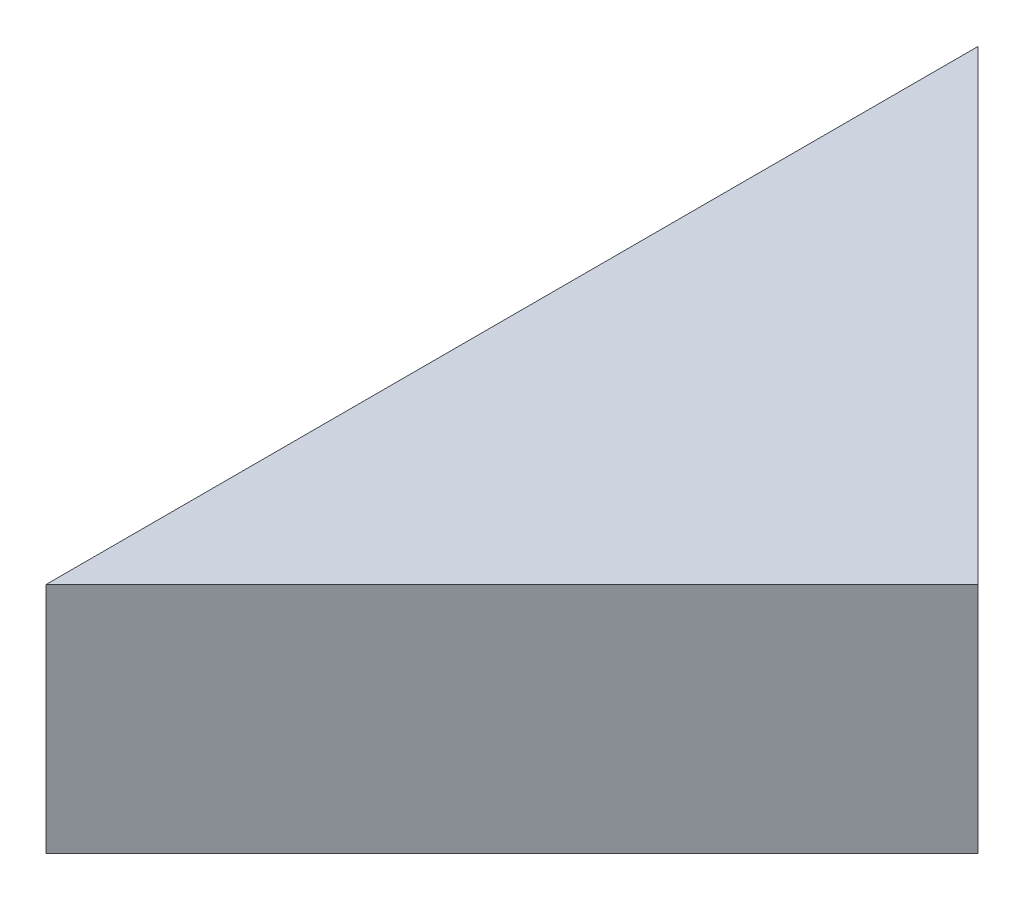
ISO-10303-21;
HEADER;
FILE_DESCRIPTION(('STEP AP214'),'2;1');
FILE_NAME('part.step','',(''),(''),'','','');
FILE_SCHEMA(('AUTOMOTIVE_DESIGN { 1 0 10303 214 1 1 1 1 }'));
ENDSEC;
DATA;
#1=APPLICATION_CONTEXT('core data for automotive mechanical design processes');
#2=APPLICATION_PROTOCOL_DEFINITION('international standard','automotive_design',2000,#1);
#3=PRODUCT_CONTEXT('',#1,'mechanical');
#4=PRODUCT('Part','Part','',(#3));
#5=PRODUCT_RELATED_PRODUCT_CATEGORY('part','',(#4));
#6=PRODUCT_DEFINITION_FORMATION('','',#4);
#7=PRODUCT_DEFINITION_CONTEXT('part definition',#1,'design');
#8=PRODUCT_DEFINITION('design','',#6,#7);
#9=PRODUCT_DEFINITION_SHAPE('','',#8);
#10=(LENGTH_UNIT() NAMED_UNIT(*) SI_UNIT(.MILLI.,.METRE.));
#11=(NAMED_UNIT(*) PLANE_ANGLE_UNIT() SI_UNIT($,.RADIAN.));
#12=(NAMED_UNIT(*) SI_UNIT($,.STERADIAN.) SOLID_ANGLE_UNIT());
#13=UNCERTAINTY_MEASURE_WITH_UNIT(LENGTH_MEASURE(1.E-05),#10,'distance_accuracy_value','');
#14=(GEOMETRIC_REPRESENTATION_CONTEXT(3) GLOBAL_UNCERTAINTY_ASSIGNED_CONTEXT((#13)) GLOBAL_UNIT_ASSIGNED_CONTEXT((#10,
#11,#12)) REPRESENTATION_CONTEXT('',''));
#15=CARTESIAN_POINT('',(0.,0.,0.));
#16=DIRECTION('',(0.,0.,1.));
#17=DIRECTION('',(1.,0.,0.));
#18=AXIS2_PLACEMENT_3D('',#15,#16,#17);
#19=CARTESIAN_POINT('',(30.0000000000001,15.,-30.));
#20=DIRECTION('',(-0.707106781186546,0.,-0.707106781186549));
#21=DIRECTION('',(-0.707106781186549,0.,0.707106781186546));
#22=AXIS2_PLACEMENT_3D('',#19,#20,#21);
#23=PLANE('',#22);
#24=DIRECTION('',(0.707106781186549,0.,-0.707106781186546));
#25=VECTOR('',#24,1.);
#26=CARTESIAN_POINT('',(30.0000000000001,0.,-30.));
#27=LINE('',#26,#25);
#28=CARTESIAN_POINT('',(0.,0.,0.));
#29=VERTEX_POINT('',#28);
#30=CARTESIAN_POINT('',(30.0000000000001,0.,-30.));
#31=VERTEX_POINT('',#30);
#32=EDGE_CURVE('E80',#29,#31,#27,.T.);
#33=ORIENTED_EDGE('',*,*,#32,.T.);
#34=DIRECTION('',(0.,-1.,0.));
#35=VECTOR('',#34,1.);
#36=CARTESIAN_POINT('',(30.0000000000001,15.,-30.));
#37=LINE('',#36,#35);
#38=CARTESIAN_POINT('',(30.0000000000001,15.,-30.));
#39=VERTEX_POINT('',#38);
#40=EDGE_CURVE('E11',#39,#31,#37,.T.);
#41=ORIENTED_EDGE('',*,*,#40,.F.);
#42=DIRECTION('',(0.707106781186549,0.,-0.707106781186546));
#43=VECTOR('',#42,1.);
#44=CARTESIAN_POINT('',(30.0000000000001,15.,-30.));
#45=LINE('',#44,#43);
#46=CARTESIAN_POINT('',(0.,15.,0.));
#47=VERTEX_POINT('',#46);
#48=EDGE_CURVE('E73',#47,#39,#45,.T.);
#49=ORIENTED_EDGE('',*,*,#48,.F.);
#50=DIRECTION('',(0.,-1.,0.));
#51=VECTOR('',#50,1.);
#52=CARTESIAN_POINT('',(0.,15.,0.));
#53=LINE('',#52,#51);
#54=EDGE_CURVE('E81',#47,#29,#53,.T.);
#55=ORIENTED_EDGE('',*,*,#54,.T.);
#56=EDGE_LOOP('',(#33,#41,#49,#55));
#57=FACE_BOUND('',#56,.T.);
#58=ADVANCED_FACE('F33',(#57),#23,.F.);
#59=CARTESIAN_POINT('',(0.,15.,-60.));
#60=DIRECTION('',(-0.707106781186546,0.,0.707106781186549));
#61=DIRECTION('',(0.707106781186549,0.,0.707106781186546));
#62=AXIS2_PLACEMENT_3D('',#59,#60,#61);
#63=PLANE('',#62);
#64=DIRECTION('',(-0.707106781186549,0.,-0.707106781186546));
#65=VECTOR('',#64,1.);
#66=CARTESIAN_POINT('',(0.,0.,-60.));
#67=LINE('',#66,#65);
#68=CARTESIAN_POINT('',(0.,0.,-60.));
#69=VERTEX_POINT('',#68);
#70=EDGE_CURVE('E61',#31,#69,#67,.T.);
#71=ORIENTED_EDGE('',*,*,#70,.T.);
#72=DIRECTION('',(0.,-1.,0.));
#73=VECTOR('',#72,1.);
#74=CARTESIAN_POINT('',(0.,15.,-60.));
#75=LINE('',#74,#73);
#76=CARTESIAN_POINT('',(0.,15.,-60.));
#77=VERTEX_POINT('',#76);
#78=EDGE_CURVE('E41',#77,#69,#75,.T.);
#79=ORIENTED_EDGE('',*,*,#78,.F.);
#80=DIRECTION('',(-0.707106781186549,0.,-0.707106781186546));
#81=VECTOR('',#80,1.);
#82=CARTESIAN_POINT('',(0.,15.,-60.));
#83=LINE('',#82,#81);
#84=EDGE_CURVE('E69',#39,#77,#83,.T.);
#85=ORIENTED_EDGE('',*,*,#84,.F.);
#86=ORIENTED_EDGE('',*,*,#40,.T.);
#87=EDGE_LOOP('',(#71,#79,#85,#86));
#88=FACE_BOUND('',#87,.T.);
#89=ADVANCED_FACE('F70',(#88),#63,.F.);
#90=CARTESIAN_POINT('',(0.,15.,0.));
#91=DIRECTION('',(1.,0.,0.));
#92=DIRECTION('',(0.,0.,-1.));
#93=AXIS2_PLACEMENT_3D('',#90,#91,#92);
#94=PLANE('',#93);
#95=DIRECTION('',(0.,0.,1.));
#96=VECTOR('',#95,1.);
#97=CARTESIAN_POINT('',(0.,0.,0.));
#98=LINE('',#97,#96);
#99=EDGE_CURVE('E66',#69,#29,#98,.T.);
#100=ORIENTED_EDGE('',*,*,#99,.T.);
#101=ORIENTED_EDGE('',*,*,#54,.F.);
#102=DIRECTION('',(0.,0.,1.));
#103=VECTOR('',#102,1.);
#104=CARTESIAN_POINT('',(0.,15.,0.));
#105=LINE('',#104,#103);
#106=EDGE_CURVE('E49',#77,#47,#105,.T.);
#107=ORIENTED_EDGE('',*,*,#106,.F.);
#108=ORIENTED_EDGE('',*,*,#78,.T.);
#109=EDGE_LOOP('',(#100,#101,#107,#108));
#110=FACE_BOUND('',#109,.T.);
#111=ADVANCED_FACE('F88',(#110),#94,.F.);
#112=CARTESIAN_POINT('',(0.,15.,0.));
#113=DIRECTION('',(0.,1.,0.));
#114=DIRECTION('',(0.,0.,1.));
#115=AXIS2_PLACEMENT_3D('',#112,#113,#114);
#116=PLANE('',#115);
#117=ORIENTED_EDGE('',*,*,#48,.T.);
#118=ORIENTED_EDGE('',*,*,#84,.T.);
#119=ORIENTED_EDGE('',*,*,#106,.T.);
#120=EDGE_LOOP('',(#117,#118,#119));
#121=FACE_BOUND('',#120,.T.);
#122=ADVANCED_FACE('F76',(#121),#116,.T.);
#123=CARTESIAN_POINT('',(0.,0.,0.));
#124=DIRECTION('',(0.,1.,0.));
#125=DIRECTION('',(0.,0.,1.));
#126=AXIS2_PLACEMENT_3D('',#123,#124,#125);
#127=PLANE('',#126);
#128=ORIENTED_EDGE('',*,*,#32,.F.);
#129=ORIENTED_EDGE('',*,*,#99,.F.);
#130=ORIENTED_EDGE('',*,*,#70,.F.);
#131=EDGE_LOOP('',(#128,#129,#130));
#132=FACE_BOUND('',#131,.T.);
#133=ADVANCED_FACE('F89',(#132),#127,.F.);
#134=CLOSED_SHELL('',(#58,#89,#111,#122,#133));
#135=MANIFOLD_SOLID_BREP('B2',#134);
#136=ADVANCED_BREP_SHAPE_REPRESENTATION('',(#18,#135),#14);
#137=SHAPE_DEFINITION_REPRESENTATION(#9,#136);
ENDSEC;
END-ISO-10303-21;
